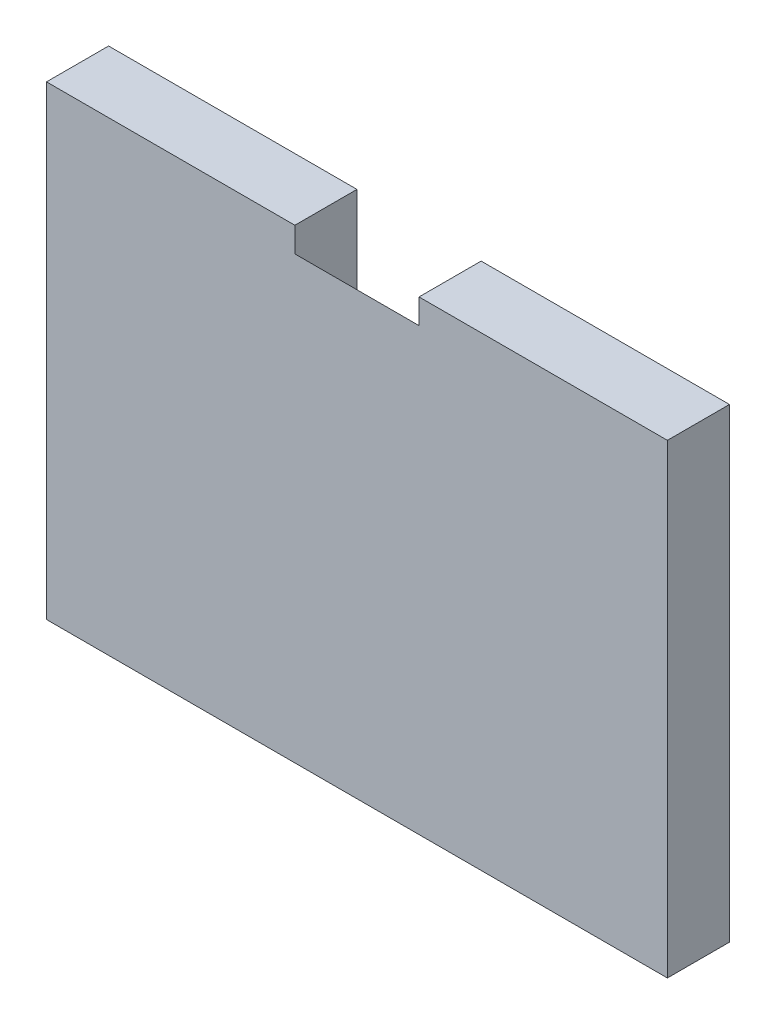
ISO-10303-21;
HEADER;
FILE_DESCRIPTION(('STEP AP214'),'2;1');
FILE_NAME('part.step','',(''),(''),'','','');
FILE_SCHEMA(('AUTOMOTIVE_DESIGN { 1 0 10303 214 1 1 1 1 }'));
ENDSEC;
DATA;
#1=APPLICATION_CONTEXT('core data for automotive mechanical design processes');
#2=APPLICATION_PROTOCOL_DEFINITION('international standard','automotive_design',2000,#1);
#3=PRODUCT_CONTEXT('',#1,'mechanical');
#4=PRODUCT('Part','Part','',(#3));
#5=PRODUCT_RELATED_PRODUCT_CATEGORY('part','',(#4));
#6=PRODUCT_DEFINITION_FORMATION('','',#4);
#7=PRODUCT_DEFINITION_CONTEXT('part definition',#1,'design');
#8=PRODUCT_DEFINITION('design','',#6,#7);
#9=PRODUCT_DEFINITION_SHAPE('','',#8);
#10=(LENGTH_UNIT() NAMED_UNIT(*) SI_UNIT(.MILLI.,.METRE.));
#11=(NAMED_UNIT(*) PLANE_ANGLE_UNIT() SI_UNIT($,.RADIAN.));
#12=(NAMED_UNIT(*) SI_UNIT($,.STERADIAN.) SOLID_ANGLE_UNIT());
#13=UNCERTAINTY_MEASURE_WITH_UNIT(LENGTH_MEASURE(1.E-05),#10,'distance_accuracy_value','');
#14=(GEOMETRIC_REPRESENTATION_CONTEXT(3) GLOBAL_UNCERTAINTY_ASSIGNED_CONTEXT((#13)) GLOBAL_UNIT_ASSIGNED_CONTEXT((#10,
#11,#12)) REPRESENTATION_CONTEXT('',''));
#15=CARTESIAN_POINT('',(0.,0.,0.));
#16=DIRECTION('',(0.,0.,1.));
#17=DIRECTION('',(1.,0.,0.));
#18=AXIS2_PLACEMENT_3D('',#15,#16,#17);
#19=CARTESIAN_POINT('',(-50.,37.5,10.));
#20=DIRECTION('',(0.,1.,0.));
#21=DIRECTION('',(0.,0.,1.));
#22=AXIS2_PLACEMENT_3D('',#19,#20,#21);
#23=PLANE('',#22);
#24=DIRECTION('',(1.,0.,0.));
#25=VECTOR('',#24,1.);
#26=CARTESIAN_POINT('',(-50.,37.5,0.));
#27=LINE('',#26,#25);
#28=CARTESIAN_POINT('',(-50.,37.5,0.));
#29=VERTEX_POINT('',#28);
#30=CARTESIAN_POINT('',(-10.,37.5,0.));
#31=VERTEX_POINT('',#30);
#32=EDGE_CURVE('E148',#29,#31,#27,.T.);
#33=ORIENTED_EDGE('',*,*,#32,.F.);
#34=DIRECTION('',(0.,0.,-1.));
#35=VECTOR('',#34,1.);
#36=CARTESIAN_POINT('',(-50.,37.5,10.));
#37=LINE('',#36,#35);
#38=CARTESIAN_POINT('',(-50.,37.5,10.));
#39=VERTEX_POINT('',#38);
#40=EDGE_CURVE('E41',#39,#29,#37,.T.);
#41=ORIENTED_EDGE('',*,*,#40,.F.);
#42=DIRECTION('',(1.,0.,0.));
#43=VECTOR('',#42,1.);
#44=CARTESIAN_POINT('',(-50.,37.5,10.));
#45=LINE('',#44,#43);
#46=CARTESIAN_POINT('',(-10.,37.5,10.));
#47=VERTEX_POINT('',#46);
#48=EDGE_CURVE('E137',#39,#47,#45,.T.);
#49=ORIENTED_EDGE('',*,*,#48,.T.);
#50=DIRECTION('',(0.,0.,-1.));
#51=VECTOR('',#50,1.);
#52=CARTESIAN_POINT('',(-10.,37.5,10.));
#53=LINE('',#52,#51);
#54=EDGE_CURVE('E11',#47,#31,#53,.T.);
#55=ORIENTED_EDGE('',*,*,#54,.T.);
#56=EDGE_LOOP('',(#33,#41,#49,#55));
#57=FACE_BOUND('',#56,.T.);
#58=ADVANCED_FACE('F32',(#57),#23,.T.);
#59=CARTESIAN_POINT('',(-50.,-37.5,10.));
#60=DIRECTION('',(-1.,0.,0.));
#61=DIRECTION('',(0.,0.,1.));
#62=AXIS2_PLACEMENT_3D('',#59,#60,#61);
#63=PLANE('',#62);
#64=DIRECTION('',(0.,1.,0.));
#65=VECTOR('',#64,1.);
#66=CARTESIAN_POINT('',(-50.,-37.5,0.));
#67=LINE('',#66,#65);
#68=CARTESIAN_POINT('',(-50.,-37.5,0.));
#69=VERTEX_POINT('',#68);
#70=EDGE_CURVE('E145',#69,#29,#67,.T.);
#71=ORIENTED_EDGE('',*,*,#70,.F.);
#72=DIRECTION('',(0.,0.,-1.));
#73=VECTOR('',#72,1.);
#74=CARTESIAN_POINT('',(-50.,-37.5,10.));
#75=LINE('',#74,#73);
#76=CARTESIAN_POINT('',(-50.,-37.5,10.));
#77=VERTEX_POINT('',#76);
#78=EDGE_CURVE('E151',#77,#69,#75,.T.);
#79=ORIENTED_EDGE('',*,*,#78,.F.);
#80=DIRECTION('',(0.,1.,0.));
#81=VECTOR('',#80,1.);
#82=CARTESIAN_POINT('',(-50.,-37.5,10.));
#83=LINE('',#82,#81);
#84=EDGE_CURVE('E134',#77,#39,#83,.T.);
#85=ORIENTED_EDGE('',*,*,#84,.T.);
#86=ORIENTED_EDGE('',*,*,#40,.T.);
#87=EDGE_LOOP('',(#71,#79,#85,#86));
#88=FACE_BOUND('',#87,.T.);
#89=ADVANCED_FACE('F177',(#88),#63,.T.);
#90=CARTESIAN_POINT('',(-50.,-37.5,10.));
#91=DIRECTION('',(0.,1.,0.));
#92=DIRECTION('',(0.,0.,1.));
#93=AXIS2_PLACEMENT_3D('',#90,#91,#92);
#94=PLANE('',#93);
#95=DIRECTION('',(1.,0.,0.));
#96=VECTOR('',#95,1.);
#97=CARTESIAN_POINT('',(-50.,-37.5,0.));
#98=LINE('',#97,#96);
#99=CARTESIAN_POINT('',(50.,-37.5,0.));
#100=VERTEX_POINT('',#99);
#101=EDGE_CURVE('E143',#69,#100,#98,.T.);
#102=ORIENTED_EDGE('',*,*,#101,.T.);
#103=DIRECTION('',(0.,0.,-1.));
#104=VECTOR('',#103,1.);
#105=CARTESIAN_POINT('',(50.,-37.5,10.));
#106=LINE('',#105,#104);
#107=CARTESIAN_POINT('',(50.,-37.5,10.));
#108=VERTEX_POINT('',#107);
#109=EDGE_CURVE('E36',#108,#100,#106,.T.);
#110=ORIENTED_EDGE('',*,*,#109,.F.);
#111=DIRECTION('',(1.,0.,0.));
#112=VECTOR('',#111,1.);
#113=CARTESIAN_POINT('',(-50.,-37.5,10.));
#114=LINE('',#113,#112);
#115=EDGE_CURVE('E132',#77,#108,#114,.T.);
#116=ORIENTED_EDGE('',*,*,#115,.F.);
#117=ORIENTED_EDGE('',*,*,#78,.T.);
#118=EDGE_LOOP('',(#102,#110,#116,#117));
#119=FACE_BOUND('',#118,.T.);
#120=ADVANCED_FACE('F183',(#119),#94,.F.);
#121=CARTESIAN_POINT('',(0.,0.,10.));
#122=DIRECTION('',(0.,0.,-1.));
#123=DIRECTION('',(-1.,0.,0.));
#124=AXIS2_PLACEMENT_3D('',#121,#122,#123);
#125=PLANE('',#124);
#126=DIRECTION('',(0.,1.,0.));
#127=VECTOR('',#126,1.);
#128=CARTESIAN_POINT('',(50.,-37.5,10.));
#129=LINE('',#128,#127);
#130=CARTESIAN_POINT('',(50.,37.5,10.));
#131=VERTEX_POINT('',#130);
#132=EDGE_CURVE('E114',#108,#131,#129,.T.);
#133=ORIENTED_EDGE('',*,*,#132,.T.);
#134=DIRECTION('',(1.,0.,0.));
#135=VECTOR('',#134,1.);
#136=CARTESIAN_POINT('',(9.99999999999999,37.5,10.));
#137=LINE('',#136,#135);
#138=CARTESIAN_POINT('',(9.99999999999999,37.5,10.));
#139=VERTEX_POINT('',#138);
#140=EDGE_CURVE('E118',#139,#131,#137,.T.);
#141=ORIENTED_EDGE('',*,*,#140,.F.);
#142=DIRECTION('',(0.,-1.,0.));
#143=VECTOR('',#142,1.);
#144=CARTESIAN_POINT('',(9.99999999999999,37.5,10.));
#145=LINE('',#144,#143);
#146=CARTESIAN_POINT('',(9.99999999999999,33.5,10.));
#147=VERTEX_POINT('',#146);
#148=EDGE_CURVE('E103',#139,#147,#145,.T.);
#149=ORIENTED_EDGE('',*,*,#148,.T.);
#150=DIRECTION('',(1.,0.,0.));
#151=VECTOR('',#150,1.);
#152=CARTESIAN_POINT('',(-10.,33.5,10.));
#153=LINE('',#152,#151);
#154=CARTESIAN_POINT('',(-10.,33.5,10.));
#155=VERTEX_POINT('',#154);
#156=EDGE_CURVE('E108',#155,#147,#153,.T.);
#157=ORIENTED_EDGE('',*,*,#156,.F.);
#158=DIRECTION('',(0.,-1.,0.));
#159=VECTOR('',#158,1.);
#160=CARTESIAN_POINT('',(-10.,37.5,10.));
#161=LINE('',#160,#159);
#162=EDGE_CURVE('E140',#47,#155,#161,.T.);
#163=ORIENTED_EDGE('',*,*,#162,.F.);
#164=ORIENTED_EDGE('',*,*,#48,.F.);
#165=ORIENTED_EDGE('',*,*,#84,.F.);
#166=ORIENTED_EDGE('',*,*,#115,.T.);
#167=EDGE_LOOP('',(#133,#141,#149,#157,#163,#164,#165,#166));
#168=FACE_BOUND('',#167,.T.);
#169=ADVANCED_FACE('F116',(#168),#125,.F.);
#170=CARTESIAN_POINT('',(0.,0.,0.));
#171=DIRECTION('',(0.,0.,-1.));
#172=DIRECTION('',(-1.,0.,0.));
#173=AXIS2_PLACEMENT_3D('',#170,#171,#172);
#174=PLANE('',#173);
#175=DIRECTION('',(1.,0.,0.));
#176=VECTOR('',#175,1.);
#177=CARTESIAN_POINT('',(-10.,23.5000000000001,1.16226472890446E-13));
#178=LINE('',#177,#176);
#179=CARTESIAN_POINT('',(-10.,23.5000000000001,0.));
#180=VERTEX_POINT('',#179);
#181=CARTESIAN_POINT('',(9.99999999999999,23.5000000000001,1.16226472890446E-13));
#182=VERTEX_POINT('',#181);
#183=EDGE_CURVE('E128',#180,#182,#178,.T.);
#184=ORIENTED_EDGE('',*,*,#183,.T.);
#185=DIRECTION('',(0.,1.,0.));
#186=VECTOR('',#185,1.);
#187=CARTESIAN_POINT('',(9.99999999999999,33.5,0.));
#188=LINE('',#187,#186);
#189=CARTESIAN_POINT('',(9.99999999999999,37.5,0.));
#190=VERTEX_POINT('',#189);
#191=EDGE_CURVE('E105',#182,#190,#188,.T.);
#192=ORIENTED_EDGE('',*,*,#191,.T.);
#193=DIRECTION('',(1.,0.,0.));
#194=VECTOR('',#193,1.);
#195=CARTESIAN_POINT('',(9.99999999999999,37.5,0.));
#196=LINE('',#195,#194);
#197=CARTESIAN_POINT('',(50.,37.5,0.));
#198=VERTEX_POINT('',#197);
#199=EDGE_CURVE('E166',#190,#198,#196,.T.);
#200=ORIENTED_EDGE('',*,*,#199,.T.);
#201=DIRECTION('',(0.,1.,0.));
#202=VECTOR('',#201,1.);
#203=CARTESIAN_POINT('',(50.,-37.5,0.));
#204=LINE('',#203,#202);
#205=EDGE_CURVE('E129',#100,#198,#204,.T.);
#206=ORIENTED_EDGE('',*,*,#205,.F.);
#207=ORIENTED_EDGE('',*,*,#101,.F.);
#208=ORIENTED_EDGE('',*,*,#70,.T.);
#209=ORIENTED_EDGE('',*,*,#32,.T.);
#210=DIRECTION('',(0.,-1.,0.));
#211=VECTOR('',#210,1.);
#212=CARTESIAN_POINT('',(-10.,37.5,0.));
#213=LINE('',#212,#211);
#214=EDGE_CURVE('E56',#31,#180,#213,.T.);
#215=ORIENTED_EDGE('',*,*,#214,.T.);
#216=EDGE_LOOP('',(#184,#192,#200,#206,#207,#208,#209,#215));
#217=FACE_BOUND('',#216,.T.);
#218=ADVANCED_FACE('F163',(#217),#174,.T.);
#219=CARTESIAN_POINT('',(50.,-37.5,10.));
#220=DIRECTION('',(-1.,0.,0.));
#221=DIRECTION('',(0.,0.,1.));
#222=AXIS2_PLACEMENT_3D('',#219,#220,#221);
#223=PLANE('',#222);
#224=ORIENTED_EDGE('',*,*,#205,.T.);
#225=DIRECTION('',(0.,0.,-1.));
#226=VECTOR('',#225,1.);
#227=CARTESIAN_POINT('',(50.,37.5,10.));
#228=LINE('',#227,#226);
#229=EDGE_CURVE('E121',#131,#198,#228,.T.);
#230=ORIENTED_EDGE('',*,*,#229,.F.);
#231=ORIENTED_EDGE('',*,*,#132,.F.);
#232=ORIENTED_EDGE('',*,*,#109,.T.);
#233=EDGE_LOOP('',(#224,#230,#231,#232));
#234=FACE_BOUND('',#233,.T.);
#235=ADVANCED_FACE('F34',(#234),#223,.F.);
#236=CARTESIAN_POINT('',(-10.,37.5,10.));
#237=DIRECTION('',(1.,0.,0.));
#238=DIRECTION('',(0.,0.,-1.));
#239=AXIS2_PLACEMENT_3D('',#236,#237,#238);
#240=PLANE('',#239);
#241=ORIENTED_EDGE('',*,*,#214,.F.);
#242=ORIENTED_EDGE('',*,*,#54,.F.);
#243=ORIENTED_EDGE('',*,*,#162,.T.);
#244=DIRECTION('',(0.,-0.707106781186548,-0.707106781186548));
#245=VECTOR('',#244,1.);
#246=CARTESIAN_POINT('',(-10.,33.5,10.));
#247=LINE('',#246,#245);
#248=EDGE_CURVE('E110',#155,#180,#247,.T.);
#249=ORIENTED_EDGE('',*,*,#248,.T.);
#250=EDGE_LOOP('',(#241,#242,#243,#249));
#251=FACE_BOUND('',#250,.T.);
#252=ADVANCED_FACE('F188',(#251),#240,.T.);
#253=CARTESIAN_POINT('',(-10.,33.5,10.));
#254=DIRECTION('',(0.,-0.707106781186547,0.707106781186547));
#255=DIRECTION('',(0.,-0.707106781186548,-0.707106781186548));
#256=AXIS2_PLACEMENT_3D('',#253,#254,#255);
#257=PLANE('',#256);
#258=ORIENTED_EDGE('',*,*,#156,.T.);
#259=DIRECTION('',(0.,-0.707106781186548,-0.707106781186548));
#260=VECTOR('',#259,1.);
#261=CARTESIAN_POINT('',(9.99999999999999,23.5000000000001,1.16226472890446E-13));
#262=LINE('',#261,#260);
#263=EDGE_CURVE('E49',#147,#182,#262,.T.);
#264=ORIENTED_EDGE('',*,*,#263,.T.);
#265=ORIENTED_EDGE('',*,*,#183,.F.);
#266=ORIENTED_EDGE('',*,*,#248,.F.);
#267=EDGE_LOOP('',(#258,#264,#265,#266));
#268=FACE_BOUND('',#267,.T.);
#269=ADVANCED_FACE('F109',(#268),#257,.F.);
#270=CARTESIAN_POINT('',(9.99999999999999,0.,0.));
#271=DIRECTION('',(-1.,0.,0.));
#272=DIRECTION('',(0.,0.,1.));
#273=AXIS2_PLACEMENT_3D('',#270,#271,#272);
#274=PLANE('',#273);
#275=ORIENTED_EDGE('',*,*,#263,.F.);
#276=ORIENTED_EDGE('',*,*,#148,.F.);
#277=DIRECTION('',(0.,0.,-1.));
#278=VECTOR('',#277,1.);
#279=CARTESIAN_POINT('',(9.99999999999999,37.5,10.));
#280=LINE('',#279,#278);
#281=EDGE_CURVE('E119',#139,#190,#280,.T.);
#282=ORIENTED_EDGE('',*,*,#281,.T.);
#283=ORIENTED_EDGE('',*,*,#191,.F.);
#284=EDGE_LOOP('',(#275,#276,#282,#283));
#285=FACE_BOUND('',#284,.T.);
#286=ADVANCED_FACE('F100',(#285),#274,.T.);
#287=CARTESIAN_POINT('',(9.99999999999999,37.5,10.));
#288=DIRECTION('',(0.,1.,0.));
#289=DIRECTION('',(0.,0.,1.));
#290=AXIS2_PLACEMENT_3D('',#287,#288,#289);
#291=PLANE('',#290);
#292=ORIENTED_EDGE('',*,*,#199,.F.);
#293=ORIENTED_EDGE('',*,*,#281,.F.);
#294=ORIENTED_EDGE('',*,*,#140,.T.);
#295=ORIENTED_EDGE('',*,*,#229,.T.);
#296=EDGE_LOOP('',(#292,#293,#294,#295));
#297=FACE_BOUND('',#296,.T.);
#298=ADVANCED_FACE('F169',(#297),#291,.T.);
#299=CLOSED_SHELL('',(#58,#89,#120,#169,#218,#235,#252,#269,#286,#298));
#300=MANIFOLD_SOLID_BREP('B2',#299);
#301=ADVANCED_BREP_SHAPE_REPRESENTATION('',(#18,#300),#14);
#302=SHAPE_DEFINITION_REPRESENTATION(#9,#301);
ENDSEC;
END-ISO-10303-21;
